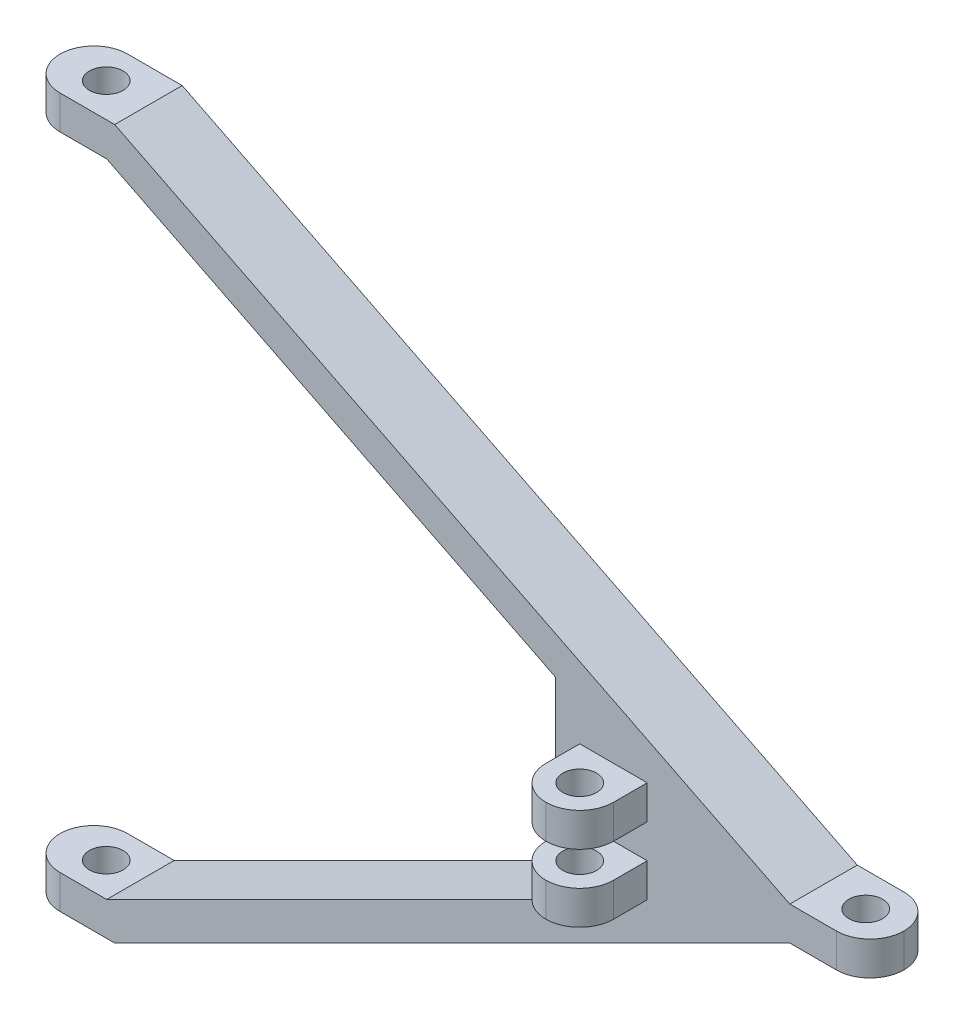
ISO-10303-21;
HEADER;
FILE_DESCRIPTION(('STEP AP214'),'2;1');
FILE_NAME('part.step','',(''),(''),'','','');
FILE_SCHEMA(('AUTOMOTIVE_DESIGN { 1 0 10303 214 1 1 1 1 }'));
ENDSEC;
DATA;
#1=APPLICATION_CONTEXT('core data for automotive mechanical design processes');
#2=APPLICATION_PROTOCOL_DEFINITION('international standard','automotive_design',2000,#1);
#3=PRODUCT_CONTEXT('',#1,'mechanical');
#4=PRODUCT('Part','Part','',(#3));
#5=PRODUCT_RELATED_PRODUCT_CATEGORY('part','',(#4));
#6=PRODUCT_DEFINITION_FORMATION('','',#4);
#7=PRODUCT_DEFINITION_CONTEXT('part definition',#1,'design');
#8=PRODUCT_DEFINITION('design','',#6,#7);
#9=PRODUCT_DEFINITION_SHAPE('','',#8);
#10=(LENGTH_UNIT() NAMED_UNIT(*) SI_UNIT(.MILLI.,.METRE.));
#11=(NAMED_UNIT(*) PLANE_ANGLE_UNIT() SI_UNIT($,.RADIAN.));
#12=(NAMED_UNIT(*) SI_UNIT($,.STERADIAN.) SOLID_ANGLE_UNIT());
#13=UNCERTAINTY_MEASURE_WITH_UNIT(LENGTH_MEASURE(1.E-05),#10,'distance_accuracy_value','');
#14=(GEOMETRIC_REPRESENTATION_CONTEXT(3) GLOBAL_UNCERTAINTY_ASSIGNED_CONTEXT((#13)) GLOBAL_UNIT_ASSIGNED_CONTEXT((#10,
#11,#12)) REPRESENTATION_CONTEXT('',''));
#15=CARTESIAN_POINT('',(0.,0.,0.));
#16=DIRECTION('',(0.,0.,1.));
#17=DIRECTION('',(1.,0.,0.));
#18=AXIS2_PLACEMENT_3D('',#15,#16,#17);
#19=CARTESIAN_POINT('',(0.,0.,20.));
#20=DIRECTION('',(0.,0.,1.));
#21=DIRECTION('',(1.,0.,0.));
#22=AXIS2_PLACEMENT_3D('',#19,#20,#21);
#23=PLANE('',#22);
#24=DIRECTION('',(1.,0.,0.));
#25=VECTOR('',#24,1.);
#26=CARTESIAN_POINT('',(200.,-4.99999999999999,20.));
#27=LINE('',#26,#25);
#28=CARTESIAN_POINT('',(201.180339887499,-4.99999999999996,20.));
#29=VERTEX_POINT('',#28);
#30=CARTESIAN_POINT('',(215.,-5.,20.));
#31=VERTEX_POINT('',#30);
#32=EDGE_CURVE('E448',#29,#31,#27,.T.);
#33=ORIENTED_EDGE('',*,*,#32,.T.);
#34=DIRECTION('',(0.,-1.,0.));
#35=VECTOR('',#34,1.);
#36=CARTESIAN_POINT('',(215.,0.,20.));
#37=LINE('',#36,#35);
#38=CARTESIAN_POINT('',(215.,5.,20.));
#39=VERTEX_POINT('',#38);
#40=EDGE_CURVE('E542',#31,#39,#37,.F.);
#41=ORIENTED_EDGE('',*,*,#40,.T.);
#42=DIRECTION('',(1.,0.,0.));
#43=VECTOR('',#42,1.);
#44=CARTESIAN_POINT('',(200.,5.00000000000001,20.));
#45=LINE('',#44,#43);
#46=CARTESIAN_POINT('',(201.180339887499,5.00000000000001,20.));
#47=VERTEX_POINT('',#46);
#48=EDGE_CURVE('E452',#47,#39,#45,.T.);
#49=ORIENTED_EDGE('',*,*,#48,.F.);
#50=DIRECTION('',(-0.894427190999916,0.447213595499958,0.));
#51=VECTOR('',#50,1.);
#52=CARTESIAN_POINT('',(202.2360679775,4.47213595499959,20.));
#53=LINE('',#52,#51);
#54=CARTESIAN_POINT('',(1.18033988749897,105.,20.));
#55=VERTEX_POINT('',#54);
#56=EDGE_CURVE('E422',#47,#55,#53,.T.);
#57=ORIENTED_EDGE('',*,*,#56,.T.);
#58=DIRECTION('',(1.,0.,0.));
#59=VECTOR('',#58,1.);
#60=CARTESIAN_POINT('',(0.,105.,20.));
#61=LINE('',#60,#59);
#62=CARTESIAN_POINT('',(-15.,105.,20.));
#63=VERTEX_POINT('',#62);
#64=EDGE_CURVE('E410',#55,#63,#61,.F.);
#65=ORIENTED_EDGE('',*,*,#64,.T.);
#66=DIRECTION('',(0.,1.,0.));
#67=VECTOR('',#66,1.);
#68=CARTESIAN_POINT('',(-15.,0.,20.));
#69=LINE('',#68,#67);
#70=CARTESIAN_POINT('',(-15.,95.,20.));
#71=VERTEX_POINT('',#70);
#72=EDGE_CURVE('E539',#63,#71,#69,.F.);
#73=ORIENTED_EDGE('',*,*,#72,.T.);
#74=DIRECTION('',(1.,0.,0.));
#75=VECTOR('',#74,1.);
#76=CARTESIAN_POINT('',(0.,95.,20.));
#77=LINE('',#76,#75);
#78=CARTESIAN_POINT('',(-1.18033988749891,95.,20.));
#79=VERTEX_POINT('',#78);
#80=EDGE_CURVE('E414',#79,#71,#77,.F.);
#81=ORIENTED_EDGE('',*,*,#80,.F.);
#82=DIRECTION('',(-0.894427190999916,0.447213595499958,0.));
#83=VECTOR('',#82,1.);
#84=CARTESIAN_POINT('',(197.7639320225,-4.47213595499957,20.));
#85=LINE('',#84,#83);
#86=CARTESIAN_POINT('',(131.729669907312,28.5449951025946,20.));
#87=VERTEX_POINT('',#86);
#88=EDGE_CURVE('E419',#87,#79,#85,.T.);
#89=ORIENTED_EDGE('',*,*,#88,.F.);
#90=DIRECTION('',(0.,-1.,0.));
#91=VECTOR('',#90,1.);
#92=CARTESIAN_POINT('',(131.729669907312,-39.7253349900934,20.));
#93=LINE('',#92,#91);
#94=CARTESIAN_POINT('',(131.729669907312,-28.5449951025946,20.));
#95=VERTEX_POINT('',#94);
#96=EDGE_CURVE('E375',#87,#95,#93,.T.);
#97=ORIENTED_EDGE('',*,*,#96,.T.);
#98=DIRECTION('',(-0.894427190999916,-0.447213595499958,0.));
#99=VECTOR('',#98,1.);
#100=CARTESIAN_POINT('',(197.7639320225,4.47213595499959,20.));
#101=LINE('',#100,#99);
#102=CARTESIAN_POINT('',(-1.18033988749892,-95.,20.));
#103=VERTEX_POINT('',#102);
#104=EDGE_CURVE('E477',#95,#103,#101,.T.);
#105=ORIENTED_EDGE('',*,*,#104,.T.);
#106=DIRECTION('',(1.,0.,0.));
#107=VECTOR('',#106,1.);
#108=CARTESIAN_POINT('',(0.,-95.,20.));
#109=LINE('',#108,#107);
#110=CARTESIAN_POINT('',(-15.,-95.,20.));
#111=VERTEX_POINT('',#110);
#112=EDGE_CURVE('E465',#103,#111,#109,.F.);
#113=ORIENTED_EDGE('',*,*,#112,.T.);
#114=DIRECTION('',(0.,1.,0.));
#115=VECTOR('',#114,1.);
#116=CARTESIAN_POINT('',(-15.,0.,20.));
#117=LINE('',#116,#115);
#118=CARTESIAN_POINT('',(-15.,-105.,20.));
#119=VERTEX_POINT('',#118);
#120=EDGE_CURVE('E536',#111,#119,#117,.F.);
#121=ORIENTED_EDGE('',*,*,#120,.T.);
#122=DIRECTION('',(1.,0.,0.));
#123=VECTOR('',#122,1.);
#124=CARTESIAN_POINT('',(0.,-105.,20.));
#125=LINE('',#124,#123);
#126=CARTESIAN_POINT('',(1.18033988749898,-105.,20.));
#127=VERTEX_POINT('',#126);
#128=EDGE_CURVE('E469',#127,#119,#125,.F.);
#129=ORIENTED_EDGE('',*,*,#128,.F.);
#130=DIRECTION('',(-0.894427190999916,-0.447213595499958,0.));
#131=VECTOR('',#130,1.);
#132=CARTESIAN_POINT('',(202.2360679775,-4.47213595499957,20.));
#133=LINE('',#132,#131);
#134=EDGE_CURVE('E474',#29,#127,#133,.T.);
#135=ORIENTED_EDGE('',*,*,#134,.F.);
#136=EDGE_LOOP('',(#33,#41,#49,#57,#65,#73,#81,#89,#97,#105,#113,#121,#129,#135));
#137=FACE_BOUND('',#136,.T.);
#138=DIRECTION('',(1.,0.,0.));
#139=VECTOR('',#138,1.);
#140=CARTESIAN_POINT('',(138.953623881755,5.,20.));
#141=LINE('',#140,#139);
#142=CARTESIAN_POINT('',(138.953623881755,5.,20.));
#143=VERTEX_POINT('',#142);
#144=CARTESIAN_POINT('',(158.953623881754,5.,20.));
#145=VERTEX_POINT('',#144);
#146=EDGE_CURVE('E347',#143,#145,#141,.T.);
#147=ORIENTED_EDGE('',*,*,#146,.F.);
#148=DIRECTION('',(0.,-1.,0.));
#149=VECTOR('',#148,1.);
#150=CARTESIAN_POINT('',(138.953623881755,15.,20.));
#151=LINE('',#150,#149);
#152=CARTESIAN_POINT('',(138.953623881755,15.,20.));
#153=VERTEX_POINT('',#152);
#154=EDGE_CURVE('E342',#153,#143,#151,.T.);
#155=ORIENTED_EDGE('',*,*,#154,.F.);
#156=DIRECTION('',(-1.,0.,0.));
#157=VECTOR('',#156,1.);
#158=CARTESIAN_POINT('',(138.953623881755,15.,20.));
#159=LINE('',#158,#157);
#160=CARTESIAN_POINT('',(158.953623881754,15.,20.));
#161=VERTEX_POINT('',#160);
#162=EDGE_CURVE('E359',#161,#153,#159,.T.);
#163=ORIENTED_EDGE('',*,*,#162,.F.);
#164=DIRECTION('',(0.,1.,0.));
#165=VECTOR('',#164,1.);
#166=CARTESIAN_POINT('',(158.953623881754,15.,20.));
#167=LINE('',#166,#165);
#168=EDGE_CURVE('E355',#145,#161,#167,.T.);
#169=ORIENTED_EDGE('',*,*,#168,.F.);
#170=EDGE_LOOP('',(#147,#155,#163,#169));
#171=FACE_BOUND('',#170,.T.);
#172=DIRECTION('',(1.,0.,0.));
#173=VECTOR('',#172,1.);
#174=CARTESIAN_POINT('',(138.953623881755,-15.,20.));
#175=LINE('',#174,#173);
#176=CARTESIAN_POINT('',(138.953623881755,-15.,20.));
#177=VERTEX_POINT('',#176);
#178=CARTESIAN_POINT('',(158.953623881754,-15.,20.));
#179=VERTEX_POINT('',#178);
#180=EDGE_CURVE('E340',#177,#179,#175,.T.);
#181=ORIENTED_EDGE('',*,*,#180,.F.);
#182=DIRECTION('',(0.,-1.,0.));
#183=VECTOR('',#182,1.);
#184=CARTESIAN_POINT('',(138.953623881755,-15.,20.));
#185=LINE('',#184,#183);
#186=CARTESIAN_POINT('',(138.953623881755,-5.,20.));
#187=VERTEX_POINT('',#186);
#188=EDGE_CURVE('E321',#187,#177,#185,.T.);
#189=ORIENTED_EDGE('',*,*,#188,.F.);
#190=DIRECTION('',(-1.,0.,0.));
#191=VECTOR('',#190,1.);
#192=CARTESIAN_POINT('',(138.953623881755,-5.,20.));
#193=LINE('',#192,#191);
#194=CARTESIAN_POINT('',(158.953623881754,-5.,20.));
#195=VERTEX_POINT('',#194);
#196=EDGE_CURVE('E327',#195,#187,#193,.T.);
#197=ORIENTED_EDGE('',*,*,#196,.F.);
#198=DIRECTION('',(0.,1.,0.));
#199=VECTOR('',#198,1.);
#200=CARTESIAN_POINT('',(158.953623881754,-15.,20.));
#201=LINE('',#200,#199);
#202=EDGE_CURVE('E337',#179,#195,#201,.T.);
#203=ORIENTED_EDGE('',*,*,#202,.F.);
#204=EDGE_LOOP('',(#181,#189,#197,#203));
#205=FACE_BOUND('',#204,.T.);
#206=ADVANCED_FACE('F139',(#137,#171,#205),#23,.T.);
#207=CARTESIAN_POINT('',(0.,0.,0.));
#208=DIRECTION('',(0.,0.,1.));
#209=DIRECTION('',(1.,0.,0.));
#210=AXIS2_PLACEMENT_3D('',#207,#208,#209);
#211=PLANE('',#210);
#212=DIRECTION('',(1.,0.,0.));
#213=VECTOR('',#212,1.);
#214=CARTESIAN_POINT('',(200.,5.00000000000001,0.));
#215=LINE('',#214,#213);
#216=CARTESIAN_POINT('',(201.180339887499,5.00000000000001,0.));
#217=VERTEX_POINT('',#216);
#218=CARTESIAN_POINT('',(215.,5.,0.));
#219=VERTEX_POINT('',#218);
#220=EDGE_CURVE('E453',#217,#219,#215,.T.);
#221=ORIENTED_EDGE('',*,*,#220,.T.);
#222=DIRECTION('',(0.,-1.,0.));
#223=VECTOR('',#222,1.);
#224=CARTESIAN_POINT('',(215.,-5.,0.));
#225=LINE('',#224,#223);
#226=CARTESIAN_POINT('',(215.,-5.,0.));
#227=VERTEX_POINT('',#226);
#228=EDGE_CURVE('E520',#219,#227,#225,.T.);
#229=ORIENTED_EDGE('',*,*,#228,.T.);
#230=DIRECTION('',(1.,0.,0.));
#231=VECTOR('',#230,1.);
#232=CARTESIAN_POINT('',(200.,-4.99999999999999,0.));
#233=LINE('',#232,#231);
#234=CARTESIAN_POINT('',(201.180339887499,-4.99999999999996,0.));
#235=VERTEX_POINT('',#234);
#236=EDGE_CURVE('E457',#235,#227,#233,.T.);
#237=ORIENTED_EDGE('',*,*,#236,.F.);
#238=DIRECTION('',(-0.894427190999916,-0.447213595499958,0.));
#239=VECTOR('',#238,1.);
#240=CARTESIAN_POINT('',(202.2360679775,-4.47213595499957,0.));
#241=LINE('',#240,#239);
#242=CARTESIAN_POINT('',(1.18033988749898,-105.,0.));
#243=VERTEX_POINT('',#242);
#244=EDGE_CURVE('E488',#235,#243,#241,.T.);
#245=ORIENTED_EDGE('',*,*,#244,.T.);
#246=DIRECTION('',(1.,0.,0.));
#247=VECTOR('',#246,1.);
#248=CARTESIAN_POINT('',(0.,-105.,0.));
#249=LINE('',#248,#247);
#250=CARTESIAN_POINT('',(-15.,-105.,0.));
#251=VERTEX_POINT('',#250);
#252=EDGE_CURVE('E484',#243,#251,#249,.F.);
#253=ORIENTED_EDGE('',*,*,#252,.T.);
#254=DIRECTION('',(0.,1.,0.));
#255=VECTOR('',#254,1.);
#256=CARTESIAN_POINT('',(-15.,-95.,0.));
#257=LINE('',#256,#255);
#258=CARTESIAN_POINT('',(-15.,-95.,0.));
#259=VERTEX_POINT('',#258);
#260=EDGE_CURVE('E503',#251,#259,#257,.T.);
#261=ORIENTED_EDGE('',*,*,#260,.T.);
#262=DIRECTION('',(1.,0.,0.));
#263=VECTOR('',#262,1.);
#264=CARTESIAN_POINT('',(0.,-95.,0.));
#265=LINE('',#264,#263);
#266=CARTESIAN_POINT('',(-1.18033988749892,-95.,0.));
#267=VERTEX_POINT('',#266);
#268=EDGE_CURVE('E409',#267,#259,#265,.F.);
#269=ORIENTED_EDGE('',*,*,#268,.F.);
#270=DIRECTION('',(-0.894427190999916,-0.447213595499958,0.));
#271=VECTOR('',#270,1.);
#272=CARTESIAN_POINT('',(197.7639320225,4.47213595499959,0.));
#273=LINE('',#272,#271);
#274=CARTESIAN_POINT('',(131.729669907312,-28.5449951025945,0.));
#275=VERTEX_POINT('',#274);
#276=EDGE_CURVE('E470',#275,#267,#273,.T.);
#277=ORIENTED_EDGE('',*,*,#276,.F.);
#278=DIRECTION('',(0.,-1.,0.));
#279=VECTOR('',#278,1.);
#280=CARTESIAN_POINT('',(131.729669907312,-39.7253349900934,0.));
#281=LINE('',#280,#279);
#282=CARTESIAN_POINT('',(131.729669907312,28.5449951025946,0.));
#283=VERTEX_POINT('',#282);
#284=EDGE_CURVE('E376',#283,#275,#281,.T.);
#285=ORIENTED_EDGE('',*,*,#284,.F.);
#286=DIRECTION('',(-0.894427190999916,0.447213595499958,0.));
#287=VECTOR('',#286,1.);
#288=CARTESIAN_POINT('',(197.7639320225,-4.47213595499957,0.));
#289=LINE('',#288,#287);
#290=CARTESIAN_POINT('',(-1.18033988749891,95.,0.));
#291=VERTEX_POINT('',#290);
#292=EDGE_CURVE('E435',#283,#291,#289,.T.);
#293=ORIENTED_EDGE('',*,*,#292,.T.);
#294=DIRECTION('',(1.,0.,0.));
#295=VECTOR('',#294,1.);
#296=CARTESIAN_POINT('',(0.,95.,0.));
#297=LINE('',#296,#295);
#298=CARTESIAN_POINT('',(-15.,95.,0.));
#299=VERTEX_POINT('',#298);
#300=EDGE_CURVE('E430',#291,#299,#297,.F.);
#301=ORIENTED_EDGE('',*,*,#300,.T.);
#302=DIRECTION('',(0.,1.,0.));
#303=VECTOR('',#302,1.);
#304=CARTESIAN_POINT('',(-15.,105.,0.));
#305=LINE('',#304,#303);
#306=CARTESIAN_POINT('',(-15.,105.,0.));
#307=VERTEX_POINT('',#306);
#308=EDGE_CURVE('E516',#299,#307,#305,.T.);
#309=ORIENTED_EDGE('',*,*,#308,.T.);
#310=DIRECTION('',(1.,0.,0.));
#311=VECTOR('',#310,1.);
#312=CARTESIAN_POINT('',(0.,105.,0.));
#313=LINE('',#312,#311);
#314=CARTESIAN_POINT('',(1.18033988749897,105.,0.));
#315=VERTEX_POINT('',#314);
#316=EDGE_CURVE('E426',#315,#307,#313,.F.);
#317=ORIENTED_EDGE('',*,*,#316,.F.);
#318=DIRECTION('',(-0.894427190999916,0.447213595499958,0.));
#319=VECTOR('',#318,1.);
#320=CARTESIAN_POINT('',(202.2360679775,4.47213595499959,0.));
#321=LINE('',#320,#319);
#322=EDGE_CURVE('E415',#217,#315,#321,.T.);
#323=ORIENTED_EDGE('',*,*,#322,.F.);
#324=EDGE_LOOP('',(#221,#229,#237,#245,#253,#261,#269,#277,#285,#293,#301,#309,#317,#323));
#325=FACE_BOUND('',#324,.T.);
#326=ADVANCED_FACE('F664',(#325),#211,.F.);
#327=CARTESIAN_POINT('',(202.2360679775,4.47213595499959,20.));
#328=DIRECTION('',(-0.447213595499958,-0.894427190999916,0.));
#329=DIRECTION('',(0.894427190999916,-0.447213595499958,0.));
#330=AXIS2_PLACEMENT_3D('',#327,#328,#329);
#331=PLANE('',#330);
#332=ORIENTED_EDGE('',*,*,#322,.T.);
#333=DIRECTION('',(0.,0.,-1.));
#334=VECTOR('',#333,1.);
#335=CARTESIAN_POINT('',(1.18033988749897,105.,20.));
#336=LINE('',#335,#334);
#337=EDGE_CURVE('E425',#55,#315,#336,.T.);
#338=ORIENTED_EDGE('',*,*,#337,.F.);
#339=ORIENTED_EDGE('',*,*,#56,.F.);
#340=DIRECTION('',(0.,0.,-1.));
#341=VECTOR('',#340,1.);
#342=CARTESIAN_POINT('',(201.180339887499,5.00000000000001,20.));
#343=LINE('',#342,#341);
#344=EDGE_CURVE('E447',#47,#217,#343,.T.);
#345=ORIENTED_EDGE('',*,*,#344,.T.);
#346=EDGE_LOOP('',(#332,#338,#339,#345));
#347=FACE_BOUND('',#346,.T.);
#348=ADVANCED_FACE('F667',(#347),#331,.F.);
#349=CARTESIAN_POINT('',(0.,105.,20.));
#350=DIRECTION('',(0.,-1.,0.));
#351=DIRECTION('',(0.,0.,-1.));
#352=AXIS2_PLACEMENT_3D('',#349,#350,#351);
#353=PLANE('',#352);
#354=CARTESIAN_POINT('',(-11.319660112501,105.,10.));
#355=DIRECTION('',(0.,-1.,0.));
#356=DIRECTION('',(0.,0.,-1.));
#357=AXIS2_PLACEMENT_3D('',#354,#355,#356);
#358=CIRCLE('',#357,5.);
#359=CARTESIAN_POINT('',(-11.319660112501,105.,5.));
#360=VERTEX_POINT('',#359);
#361=EDGE_CURVE('E405',#360,#360,#358,.T.);
#362=ORIENTED_EDGE('',*,*,#361,.T.);
#363=EDGE_LOOP('',(#362));
#364=FACE_BOUND('',#363,.T.);
#365=ORIENTED_EDGE('',*,*,#316,.T.);
#366=CARTESIAN_POINT('',(-15.,105.,10.));
#367=DIRECTION('',(0.,-1.,0.));
#368=DIRECTION('',(0.,0.,-1.));
#369=AXIS2_PLACEMENT_3D('',#366,#367,#368);
#370=CIRCLE('',#369,10.);
#371=CARTESIAN_POINT('',(-25.,105.,10.));
#372=VERTEX_POINT('',#371);
#373=EDGE_CURVE('E548',#307,#372,#370,.F.);
#374=ORIENTED_EDGE('',*,*,#373,.T.);
#375=CARTESIAN_POINT('',(-15.,105.,10.));
#376=DIRECTION('',(0.,-1.,0.));
#377=DIRECTION('',(0.,0.,-1.));
#378=AXIS2_PLACEMENT_3D('',#375,#376,#377);
#379=CIRCLE('',#378,10.);
#380=EDGE_CURVE('E545',#372,#63,#379,.F.);
#381=ORIENTED_EDGE('',*,*,#380,.T.);
#382=ORIENTED_EDGE('',*,*,#64,.F.);
#383=ORIENTED_EDGE('',*,*,#337,.T.);
#384=EDGE_LOOP('',(#365,#374,#381,#382,#383));
#385=FACE_BOUND('',#384,.T.);
#386=ADVANCED_FACE('F679',(#364,#385),#353,.F.);
#387=CARTESIAN_POINT('',(0.,95.,20.));
#388=DIRECTION('',(0.,-1.,0.));
#389=DIRECTION('',(0.,0.,-1.));
#390=AXIS2_PLACEMENT_3D('',#387,#388,#389);
#391=PLANE('',#390);
#392=CARTESIAN_POINT('',(-11.319660112501,95.,10.));
#393=DIRECTION('',(0.,-1.,0.));
#394=DIRECTION('',(0.,0.,-1.));
#395=AXIS2_PLACEMENT_3D('',#392,#393,#394);
#396=CIRCLE('',#395,5.);
#397=CARTESIAN_POINT('',(-11.319660112501,95.,5.));
#398=VERTEX_POINT('',#397);
#399=EDGE_CURVE('E401',#398,#398,#396,.T.);
#400=ORIENTED_EDGE('',*,*,#399,.F.);
#401=EDGE_LOOP('',(#400));
#402=FACE_BOUND('',#401,.T.);
#403=CARTESIAN_POINT('',(-15.,95.,10.));
#404=DIRECTION('',(0.,-1.,0.));
#405=DIRECTION('',(0.,0.,-1.));
#406=AXIS2_PLACEMENT_3D('',#403,#404,#405);
#407=CIRCLE('',#406,10.);
#408=CARTESIAN_POINT('',(-25.,95.,10.));
#409=VERTEX_POINT('',#408);
#410=EDGE_CURVE('E551',#71,#409,#407,.T.);
#411=ORIENTED_EDGE('',*,*,#410,.T.);
#412=CARTESIAN_POINT('',(-15.,95.,10.));
#413=DIRECTION('',(0.,-1.,0.));
#414=DIRECTION('',(0.,0.,-1.));
#415=AXIS2_PLACEMENT_3D('',#412,#413,#414);
#416=CIRCLE('',#415,10.);
#417=EDGE_CURVE('E554',#409,#299,#416,.T.);
#418=ORIENTED_EDGE('',*,*,#417,.T.);
#419=ORIENTED_EDGE('',*,*,#300,.F.);
#420=DIRECTION('',(0.,0.,-1.));
#421=VECTOR('',#420,1.);
#422=CARTESIAN_POINT('',(-1.18033988749891,95.,20.));
#423=LINE('',#422,#421);
#424=EDGE_CURVE('E443',#79,#291,#423,.T.);
#425=ORIENTED_EDGE('',*,*,#424,.F.);
#426=ORIENTED_EDGE('',*,*,#80,.T.);
#427=EDGE_LOOP('',(#411,#418,#419,#425,#426));
#428=FACE_BOUND('',#427,.T.);
#429=ADVANCED_FACE('F687',(#402,#428),#391,.T.);
#430=CARTESIAN_POINT('',(197.7639320225,-4.47213595499957,20.));
#431=DIRECTION('',(-0.447213595499958,-0.894427190999916,0.));
#432=DIRECTION('',(0.894427190999916,-0.447213595499958,0.));
#433=AXIS2_PLACEMENT_3D('',#430,#431,#432);
#434=PLANE('',#433);
#435=DIRECTION('',(0.,0.,-1.));
#436=VECTOR('',#435,1.);
#437=CARTESIAN_POINT('',(131.729669907312,28.5449951025946,20.));
#438=LINE('',#437,#436);
#439=EDGE_CURVE('E385',#87,#283,#438,.T.);
#440=ORIENTED_EDGE('',*,*,#439,.F.);
#441=ORIENTED_EDGE('',*,*,#88,.T.);
#442=ORIENTED_EDGE('',*,*,#424,.T.);
#443=ORIENTED_EDGE('',*,*,#292,.F.);
#444=EDGE_LOOP('',(#440,#441,#442,#443));
#445=FACE_BOUND('',#444,.T.);
#446=ADVANCED_FACE('F691',(#445),#434,.T.);
#447=CARTESIAN_POINT('',(197.7639320225,4.47213595499959,20.));
#448=DIRECTION('',(0.447213595499958,-0.894427190999916,0.));
#449=DIRECTION('',(0.894427190999916,0.447213595499958,0.));
#450=AXIS2_PLACEMENT_3D('',#447,#448,#449);
#451=PLANE('',#450);
#452=ORIENTED_EDGE('',*,*,#104,.F.);
#453=DIRECTION('',(0.,0.,-1.));
#454=VECTOR('',#453,1.);
#455=CARTESIAN_POINT('',(131.729669907312,-28.5449951025945,20.));
#456=LINE('',#455,#454);
#457=EDGE_CURVE('E379',#95,#275,#456,.T.);
#458=ORIENTED_EDGE('',*,*,#457,.T.);
#459=ORIENTED_EDGE('',*,*,#276,.T.);
#460=DIRECTION('',(0.,0.,-1.));
#461=VECTOR('',#460,1.);
#462=CARTESIAN_POINT('',(-1.18033988749892,-95.,20.));
#463=LINE('',#462,#461);
#464=EDGE_CURVE('E480',#103,#267,#463,.T.);
#465=ORIENTED_EDGE('',*,*,#464,.F.);
#466=EDGE_LOOP('',(#452,#458,#459,#465));
#467=FACE_BOUND('',#466,.T.);
#468=ADVANCED_FACE('F693',(#467),#451,.F.);
#469=CARTESIAN_POINT('',(0.,-95.,20.));
#470=DIRECTION('',(0.,-1.,0.));
#471=DIRECTION('',(0.,0.,-1.));
#472=AXIS2_PLACEMENT_3D('',#469,#470,#471);
#473=PLANE('',#472);
#474=CARTESIAN_POINT('',(-11.319660112501,-95.,10.));
#475=DIRECTION('',(0.,-1.,0.));
#476=DIRECTION('',(0.,0.,-1.));
#477=AXIS2_PLACEMENT_3D('',#474,#475,#476);
#478=CIRCLE('',#477,5.);
#479=CARTESIAN_POINT('',(-11.319660112501,-95.,5.));
#480=VERTEX_POINT('',#479);
#481=EDGE_CURVE('E397',#480,#480,#478,.T.);
#482=ORIENTED_EDGE('',*,*,#481,.T.);
#483=EDGE_LOOP('',(#482));
#484=FACE_BOUND('',#483,.T.);
#485=ORIENTED_EDGE('',*,*,#268,.T.);
#486=CARTESIAN_POINT('',(-15.,-95.,10.));
#487=DIRECTION('',(0.,-1.,0.));
#488=DIRECTION('',(0.,0.,-1.));
#489=AXIS2_PLACEMENT_3D('',#486,#487,#488);
#490=CIRCLE('',#489,10.);
#491=CARTESIAN_POINT('',(-25.,-95.,10.));
#492=VERTEX_POINT('',#491);
#493=EDGE_CURVE('E560',#259,#492,#490,.F.);
#494=ORIENTED_EDGE('',*,*,#493,.T.);
#495=CARTESIAN_POINT('',(-15.,-95.,10.));
#496=DIRECTION('',(0.,-1.,0.));
#497=DIRECTION('',(0.,0.,-1.));
#498=AXIS2_PLACEMENT_3D('',#495,#496,#497);
#499=CIRCLE('',#498,10.);
#500=EDGE_CURVE('E557',#492,#111,#499,.F.);
#501=ORIENTED_EDGE('',*,*,#500,.T.);
#502=ORIENTED_EDGE('',*,*,#112,.F.);
#503=ORIENTED_EDGE('',*,*,#464,.T.);
#504=EDGE_LOOP('',(#485,#494,#501,#502,#503));
#505=FACE_BOUND('',#504,.T.);
#506=ADVANCED_FACE('F708',(#484,#505),#473,.F.);
#507=CARTESIAN_POINT('',(0.,-105.,20.));
#508=DIRECTION('',(0.,-1.,0.));
#509=DIRECTION('',(0.,0.,-1.));
#510=AXIS2_PLACEMENT_3D('',#507,#508,#509);
#511=PLANE('',#510);
#512=CARTESIAN_POINT('',(-11.319660112501,-105.,10.));
#513=DIRECTION('',(0.,-1.,0.));
#514=DIRECTION('',(0.,0.,-1.));
#515=AXIS2_PLACEMENT_3D('',#512,#513,#514);
#516=CIRCLE('',#515,5.);
#517=CARTESIAN_POINT('',(-11.319660112501,-105.,5.));
#518=VERTEX_POINT('',#517);
#519=EDGE_CURVE('E388',#518,#518,#516,.T.);
#520=ORIENTED_EDGE('',*,*,#519,.F.);
#521=EDGE_LOOP('',(#520));
#522=FACE_BOUND('',#521,.T.);
#523=CARTESIAN_POINT('',(-15.,-105.,10.));
#524=DIRECTION('',(0.,-1.,0.));
#525=DIRECTION('',(0.,0.,-1.));
#526=AXIS2_PLACEMENT_3D('',#523,#524,#525);
#527=CIRCLE('',#526,10.);
#528=CARTESIAN_POINT('',(-25.,-105.,10.));
#529=VERTEX_POINT('',#528);
#530=EDGE_CURVE('E563',#119,#529,#527,.T.);
#531=ORIENTED_EDGE('',*,*,#530,.T.);
#532=CARTESIAN_POINT('',(-15.,-105.,10.));
#533=DIRECTION('',(0.,-1.,0.));
#534=DIRECTION('',(0.,0.,-1.));
#535=AXIS2_PLACEMENT_3D('',#532,#533,#534);
#536=CIRCLE('',#535,10.);
#537=EDGE_CURVE('E566',#529,#251,#536,.T.);
#538=ORIENTED_EDGE('',*,*,#537,.T.);
#539=ORIENTED_EDGE('',*,*,#252,.F.);
#540=DIRECTION('',(0.,0.,-1.));
#541=VECTOR('',#540,1.);
#542=CARTESIAN_POINT('',(1.18033988749898,-105.,20.));
#543=LINE('',#542,#541);
#544=EDGE_CURVE('E461',#127,#243,#543,.T.);
#545=ORIENTED_EDGE('',*,*,#544,.F.);
#546=ORIENTED_EDGE('',*,*,#128,.T.);
#547=EDGE_LOOP('',(#531,#538,#539,#545,#546));
#548=FACE_BOUND('',#547,.T.);
#549=ADVANCED_FACE('F712',(#522,#548),#511,.T.);
#550=CARTESIAN_POINT('',(202.2360679775,-4.47213595499957,20.));
#551=DIRECTION('',(0.447213595499958,-0.894427190999916,0.));
#552=DIRECTION('',(0.894427190999916,0.447213595499958,0.));
#553=AXIS2_PLACEMENT_3D('',#550,#551,#552);
#554=PLANE('',#553);
#555=ORIENTED_EDGE('',*,*,#134,.T.);
#556=ORIENTED_EDGE('',*,*,#544,.T.);
#557=ORIENTED_EDGE('',*,*,#244,.F.);
#558=DIRECTION('',(0.,0.,-1.));
#559=VECTOR('',#558,1.);
#560=CARTESIAN_POINT('',(201.180339887499,-4.99999999999999,20.));
#561=LINE('',#560,#559);
#562=EDGE_CURVE('E431',#29,#235,#561,.T.);
#563=ORIENTED_EDGE('',*,*,#562,.F.);
#564=EDGE_LOOP('',(#555,#556,#557,#563));
#565=FACE_BOUND('',#564,.T.);
#566=ADVANCED_FACE('F704',(#565),#554,.T.);
#567=CARTESIAN_POINT('',(200.,-4.99999999999999,20.));
#568=DIRECTION('',(0.,1.,0.));
#569=DIRECTION('',(-1.,0.,0.));
#570=AXIS2_PLACEMENT_3D('',#567,#568,#569);
#571=PLANE('',#570);
#572=CARTESIAN_POINT('',(213.680339887499,-5.,10.));
#573=DIRECTION('',(0.,1.,0.));
#574=DIRECTION('',(-1.,0.,0.));
#575=AXIS2_PLACEMENT_3D('',#572,#573,#574);
#576=CIRCLE('',#575,4.99999999999999);
#577=CARTESIAN_POINT('',(208.680339887499,-5.,10.));
#578=VERTEX_POINT('',#577);
#579=EDGE_CURVE('E393',#578,#578,#576,.T.);
#580=ORIENTED_EDGE('',*,*,#579,.T.);
#581=EDGE_LOOP('',(#580));
#582=FACE_BOUND('',#581,.T.);
#583=ORIENTED_EDGE('',*,*,#236,.T.);
#584=CARTESIAN_POINT('',(215.,-5.,10.));
#585=DIRECTION('',(0.,1.,0.));
#586=DIRECTION('',(-1.,0.,0.));
#587=AXIS2_PLACEMENT_3D('',#584,#585,#586);
#588=CIRCLE('',#587,10.);
#589=CARTESIAN_POINT('',(225.,-5.,10.));
#590=VERTEX_POINT('',#589);
#591=EDGE_CURVE('E527',#227,#590,#588,.F.);
#592=ORIENTED_EDGE('',*,*,#591,.T.);
#593=CARTESIAN_POINT('',(215.,-5.,10.));
#594=DIRECTION('',(0.,1.,0.));
#595=DIRECTION('',(-1.,0.,0.));
#596=AXIS2_PLACEMENT_3D('',#593,#594,#595);
#597=CIRCLE('',#596,10.);
#598=EDGE_CURVE('E524',#590,#31,#597,.F.);
#599=ORIENTED_EDGE('',*,*,#598,.T.);
#600=ORIENTED_EDGE('',*,*,#32,.F.);
#601=ORIENTED_EDGE('',*,*,#562,.T.);
#602=EDGE_LOOP('',(#583,#592,#599,#600,#601));
#603=FACE_BOUND('',#602,.T.);
#604=ADVANCED_FACE('F700',(#582,#603),#571,.F.);
#605=CARTESIAN_POINT('',(200.,5.00000000000001,20.));
#606=DIRECTION('',(0.,1.,0.));
#607=DIRECTION('',(-1.,0.,0.));
#608=AXIS2_PLACEMENT_3D('',#605,#606,#607);
#609=PLANE('',#608);
#610=CARTESIAN_POINT('',(213.680339887499,5.,10.));
#611=DIRECTION('',(0.,1.,0.));
#612=DIRECTION('',(-1.,0.,0.));
#613=AXIS2_PLACEMENT_3D('',#610,#611,#612);
#614=CIRCLE('',#613,4.99999999999999);
#615=CARTESIAN_POINT('',(208.680339887499,5.00000000000001,10.));
#616=VERTEX_POINT('',#615);
#617=EDGE_CURVE('E392',#616,#616,#614,.T.);
#618=ORIENTED_EDGE('',*,*,#617,.F.);
#619=EDGE_LOOP('',(#618));
#620=FACE_BOUND('',#619,.T.);
#621=CARTESIAN_POINT('',(215.,5.,10.));
#622=DIRECTION('',(0.,1.,0.));
#623=DIRECTION('',(-1.,0.,0.));
#624=AXIS2_PLACEMENT_3D('',#621,#622,#623);
#625=CIRCLE('',#624,10.);
#626=CARTESIAN_POINT('',(225.,5.,10.));
#627=VERTEX_POINT('',#626);
#628=EDGE_CURVE('E530',#39,#627,#625,.T.);
#629=ORIENTED_EDGE('',*,*,#628,.T.);
#630=CARTESIAN_POINT('',(215.,5.,10.));
#631=DIRECTION('',(0.,1.,0.));
#632=DIRECTION('',(-1.,0.,0.));
#633=AXIS2_PLACEMENT_3D('',#630,#631,#632);
#634=CIRCLE('',#633,10.);
#635=EDGE_CURVE('E533',#627,#219,#634,.T.);
#636=ORIENTED_EDGE('',*,*,#635,.T.);
#637=ORIENTED_EDGE('',*,*,#220,.F.);
#638=ORIENTED_EDGE('',*,*,#344,.F.);
#639=ORIENTED_EDGE('',*,*,#48,.T.);
#640=EDGE_LOOP('',(#629,#636,#637,#638,#639));
#641=FACE_BOUND('',#640,.T.);
#642=ADVANCED_FACE('F675',(#620,#641),#609,.T.);
#643=CARTESIAN_POINT('',(213.680339887499,130.,10.));
#644=DIRECTION('',(0.,-1.,0.));
#645=DIRECTION('',(0.,0.,-1.));
#646=AXIS2_PLACEMENT_3D('',#643,#644,#645);
#647=CYLINDRICAL_SURFACE('',#646,4.99999999999999);
#648=ORIENTED_EDGE('',*,*,#617,.T.);
#649=EDGE_LOOP('',(#648));
#650=FACE_BOUND('',#649,.T.);
#651=ORIENTED_EDGE('',*,*,#579,.F.);
#652=EDGE_LOOP('',(#651));
#653=FACE_BOUND('',#652,.T.);
#654=ADVANCED_FACE('F674',(#650,#653),#647,.F.);
#655=CARTESIAN_POINT('',(-11.319660112501,130.,10.));
#656=DIRECTION('',(0.,-1.,0.));
#657=DIRECTION('',(0.,0.,-1.));
#658=AXIS2_PLACEMENT_3D('',#655,#656,#657);
#659=CYLINDRICAL_SURFACE('',#658,5.);
#660=ORIENTED_EDGE('',*,*,#519,.T.);
#661=EDGE_LOOP('',(#660));
#662=FACE_BOUND('',#661,.T.);
#663=ORIENTED_EDGE('',*,*,#481,.F.);
#664=EDGE_LOOP('',(#663));
#665=FACE_BOUND('',#664,.T.);
#666=ADVANCED_FACE('F977',(#662,#665),#659,.F.);
#667=ORIENTED_EDGE('',*,*,#399,.T.);
#668=EDGE_LOOP('',(#667));
#669=FACE_BOUND('',#668,.T.);
#670=ORIENTED_EDGE('',*,*,#361,.F.);
#671=EDGE_LOOP('',(#670));
#672=FACE_BOUND('',#671,.T.);
#673=ADVANCED_FACE('F924',(#669,#672),#659,.F.);
#674=CARTESIAN_POINT('',(131.729669907312,-39.7253349900934,0.));
#675=DIRECTION('',(-1.,0.,0.));
#676=DIRECTION('',(0.,-1.,0.));
#677=AXIS2_PLACEMENT_3D('',#674,#675,#676);
#678=PLANE('',#677);
#679=ORIENTED_EDGE('',*,*,#96,.F.);
#680=ORIENTED_EDGE('',*,*,#439,.T.);
#681=ORIENTED_EDGE('',*,*,#284,.T.);
#682=ORIENTED_EDGE('',*,*,#457,.F.);
#683=EDGE_LOOP('',(#679,#680,#681,#682));
#684=FACE_BOUND('',#683,.T.);
#685=ADVANCED_FACE('F867',(#684),#678,.T.);
#686=CARTESIAN_POINT('',(138.953623881755,15.,40.));
#687=DIRECTION('',(1.,0.,0.));
#688=DIRECTION('',(0.,0.,-1.));
#689=AXIS2_PLACEMENT_3D('',#686,#687,#688);
#690=PLANE('',#689);
#691=DIRECTION('',(0.,0.,-1.));
#692=VECTOR('',#691,1.);
#693=CARTESIAN_POINT('',(138.953623881755,5.,40.));
#694=LINE('',#693,#692);
#695=CARTESIAN_POINT('',(138.953623881755,5.,30.));
#696=VERTEX_POINT('',#695);
#697=EDGE_CURVE('E372',#696,#143,#694,.T.);
#698=ORIENTED_EDGE('',*,*,#697,.F.);
#699=DIRECTION('',(0.,-1.,0.));
#700=VECTOR('',#699,1.);
#701=CARTESIAN_POINT('',(138.953623881755,15.,30.));
#702=LINE('',#701,#700);
#703=CARTESIAN_POINT('',(138.953623881755,15.,30.));
#704=VERTEX_POINT('',#703);
#705=EDGE_CURVE('E575',#696,#704,#702,.F.);
#706=ORIENTED_EDGE('',*,*,#705,.T.);
#707=DIRECTION('',(0.,0.,-1.));
#708=VECTOR('',#707,1.);
#709=CARTESIAN_POINT('',(138.953623881755,15.,40.));
#710=LINE('',#709,#708);
#711=EDGE_CURVE('E363',#704,#153,#710,.T.);
#712=ORIENTED_EDGE('',*,*,#711,.T.);
#713=ORIENTED_EDGE('',*,*,#154,.T.);
#714=EDGE_LOOP('',(#698,#706,#712,#713));
#715=FACE_BOUND('',#714,.T.);
#716=ADVANCED_FACE('F857',(#715),#690,.F.);
#717=CARTESIAN_POINT('',(138.953623881755,5.,40.));
#718=DIRECTION('',(0.,1.,0.));
#719=DIRECTION('',(0.,0.,1.));
#720=AXIS2_PLACEMENT_3D('',#717,#718,#719);
#721=PLANE('',#720);
#722=CARTESIAN_POINT('',(148.953623881754,5.,30.));
#723=DIRECTION('',(0.,1.,0.));
#724=DIRECTION('',(0.,0.,1.));
#725=AXIS2_PLACEMENT_3D('',#722,#723,#724);
#726=CIRCLE('',#725,4.99999999999999);
#727=CARTESIAN_POINT('',(148.953623881754,5.,35.));
#728=VERTEX_POINT('',#727);
#729=EDGE_CURVE('E639',#728,#728,#726,.T.);
#730=ORIENTED_EDGE('',*,*,#729,.T.);
#731=EDGE_LOOP('',(#730));
#732=FACE_BOUND('',#731,.T.);
#733=CARTESIAN_POINT('',(148.953623881754,5.,30.));
#734=DIRECTION('',(0.,1.,0.));
#735=DIRECTION('',(0.,0.,1.));
#736=AXIS2_PLACEMENT_3D('',#733,#734,#735);
#737=CIRCLE('',#736,10.);
#738=CARTESIAN_POINT('',(158.953623881754,5.,30.));
#739=VERTEX_POINT('',#738);
#740=CARTESIAN_POINT('',(148.953623881754,5.,40.));
#741=VERTEX_POINT('',#740);
#742=EDGE_CURVE('E569',#739,#741,#737,.F.);
#743=ORIENTED_EDGE('',*,*,#742,.T.);
#744=CARTESIAN_POINT('',(148.953623881755,5.,30.));
#745=DIRECTION('',(0.,1.,0.));
#746=DIRECTION('',(0.,0.,1.));
#747=AXIS2_PLACEMENT_3D('',#744,#745,#746);
#748=CIRCLE('',#747,10.);
#749=EDGE_CURVE('E572',#741,#696,#748,.F.);
#750=ORIENTED_EDGE('',*,*,#749,.T.);
#751=ORIENTED_EDGE('',*,*,#697,.T.);
#752=ORIENTED_EDGE('',*,*,#146,.T.);
#753=DIRECTION('',(0.,0.,-1.));
#754=VECTOR('',#753,1.);
#755=CARTESIAN_POINT('',(158.953623881754,5.,40.));
#756=LINE('',#755,#754);
#757=EDGE_CURVE('E369',#739,#145,#756,.T.);
#758=ORIENTED_EDGE('',*,*,#757,.F.);
#759=EDGE_LOOP('',(#743,#750,#751,#752,#758));
#760=FACE_BOUND('',#759,.T.);
#761=ADVANCED_FACE('F846',(#732,#760),#721,.F.);
#762=CARTESIAN_POINT('',(158.953623881754,15.,40.));
#763=DIRECTION('',(-1.,0.,0.));
#764=DIRECTION('',(0.,0.,1.));
#765=AXIS2_PLACEMENT_3D('',#762,#763,#764);
#766=PLANE('',#765);
#767=DIRECTION('',(0.,0.,-1.));
#768=VECTOR('',#767,1.);
#769=CARTESIAN_POINT('',(158.953623881754,15.,40.));
#770=LINE('',#769,#768);
#771=CARTESIAN_POINT('',(158.953623881754,15.,30.));
#772=VERTEX_POINT('',#771);
#773=EDGE_CURVE('E366',#772,#161,#770,.T.);
#774=ORIENTED_EDGE('',*,*,#773,.F.);
#775=DIRECTION('',(0.,1.,0.));
#776=VECTOR('',#775,1.);
#777=CARTESIAN_POINT('',(158.953623881754,5.,30.));
#778=LINE('',#777,#776);
#779=EDGE_CURVE('E585',#772,#739,#778,.F.);
#780=ORIENTED_EDGE('',*,*,#779,.T.);
#781=ORIENTED_EDGE('',*,*,#757,.T.);
#782=ORIENTED_EDGE('',*,*,#168,.T.);
#783=EDGE_LOOP('',(#774,#780,#781,#782));
#784=FACE_BOUND('',#783,.T.);
#785=ADVANCED_FACE('F835',(#784),#766,.F.);
#786=CARTESIAN_POINT('',(138.953623881755,15.,40.));
#787=DIRECTION('',(0.,-1.,0.));
#788=DIRECTION('',(0.,0.,-1.));
#789=AXIS2_PLACEMENT_3D('',#786,#787,#788);
#790=PLANE('',#789);
#791=CARTESIAN_POINT('',(148.953623881754,15.,30.));
#792=DIRECTION('',(0.,-1.,0.));
#793=DIRECTION('',(0.,0.,-1.));
#794=AXIS2_PLACEMENT_3D('',#791,#792,#793);
#795=CIRCLE('',#794,4.99999999999999);
#796=CARTESIAN_POINT('',(148.953623881754,15.,25.));
#797=VERTEX_POINT('',#796);
#798=EDGE_CURVE('E511',#797,#797,#795,.T.);
#799=ORIENTED_EDGE('',*,*,#798,.T.);
#800=EDGE_LOOP('',(#799));
#801=FACE_BOUND('',#800,.T.);
#802=ORIENTED_EDGE('',*,*,#711,.F.);
#803=CARTESIAN_POINT('',(148.953623881755,15.,30.));
#804=DIRECTION('',(0.,-1.,0.));
#805=DIRECTION('',(0.,0.,-1.));
#806=AXIS2_PLACEMENT_3D('',#803,#804,#805);
#807=CIRCLE('',#806,10.);
#808=CARTESIAN_POINT('',(148.953623881754,15.,40.));
#809=VERTEX_POINT('',#808);
#810=EDGE_CURVE('E582',#704,#809,#807,.F.);
#811=ORIENTED_EDGE('',*,*,#810,.T.);
#812=CARTESIAN_POINT('',(148.953623881754,15.,30.));
#813=DIRECTION('',(0.,-1.,0.));
#814=DIRECTION('',(0.,0.,-1.));
#815=AXIS2_PLACEMENT_3D('',#812,#813,#814);
#816=CIRCLE('',#815,10.);
#817=EDGE_CURVE('E579',#809,#772,#816,.F.);
#818=ORIENTED_EDGE('',*,*,#817,.T.);
#819=ORIENTED_EDGE('',*,*,#773,.T.);
#820=ORIENTED_EDGE('',*,*,#162,.T.);
#821=EDGE_LOOP('',(#802,#811,#818,#819,#820));
#822=FACE_BOUND('',#821,.T.);
#823=ADVANCED_FACE('F661',(#801,#822),#790,.F.);
#824=CARTESIAN_POINT('',(138.953623881755,-15.,40.));
#825=DIRECTION('',(1.,0.,0.));
#826=DIRECTION('',(0.,0.,-1.));
#827=AXIS2_PLACEMENT_3D('',#824,#825,#826);
#828=PLANE('',#827);
#829=DIRECTION('',(0.,0.,-1.));
#830=VECTOR('',#829,1.);
#831=CARTESIAN_POINT('',(138.953623881755,-15.,40.));
#832=LINE('',#831,#830);
#833=CARTESIAN_POINT('',(138.953623881755,-15.,30.));
#834=VERTEX_POINT('',#833);
#835=EDGE_CURVE('E633',#834,#177,#832,.T.);
#836=ORIENTED_EDGE('',*,*,#835,.F.);
#837=DIRECTION('',(0.,-1.,0.));
#838=VECTOR('',#837,1.);
#839=CARTESIAN_POINT('',(138.953623881755,-15.,30.));
#840=LINE('',#839,#838);
#841=CARTESIAN_POINT('',(138.953623881755,-5.,30.));
#842=VERTEX_POINT('',#841);
#843=EDGE_CURVE('E12',#834,#842,#840,.F.);
#844=ORIENTED_EDGE('',*,*,#843,.T.);
#845=DIRECTION('',(0.,0.,-1.));
#846=VECTOR('',#845,1.);
#847=CARTESIAN_POINT('',(138.953623881755,-5.,40.));
#848=LINE('',#847,#846);
#849=EDGE_CURVE('E317',#842,#187,#848,.T.);
#850=ORIENTED_EDGE('',*,*,#849,.T.);
#851=ORIENTED_EDGE('',*,*,#188,.T.);
#852=EDGE_LOOP('',(#836,#844,#850,#851));
#853=FACE_BOUND('',#852,.T.);
#854=ADVANCED_FACE('F319',(#853),#828,.F.);
#855=CARTESIAN_POINT('',(138.953623881755,-15.,40.));
#856=DIRECTION('',(0.,1.,0.));
#857=DIRECTION('',(0.,0.,1.));
#858=AXIS2_PLACEMENT_3D('',#855,#856,#857);
#859=PLANE('',#858);
#860=CARTESIAN_POINT('',(148.953623881754,-15.,30.));
#861=DIRECTION('',(0.,-1.,0.));
#862=DIRECTION('',(0.,0.,-1.));
#863=AXIS2_PLACEMENT_3D('',#860,#861,#862);
#864=CIRCLE('',#863,4.99999999999999);
#865=CARTESIAN_POINT('',(148.953623881754,-15.,25.));
#866=VERTEX_POINT('',#865);
#867=EDGE_CURVE('E512',#866,#866,#864,.T.);
#868=ORIENTED_EDGE('',*,*,#867,.F.);
#869=EDGE_LOOP('',(#868));
#870=FACE_BOUND('',#869,.T.);
#871=DIRECTION('',(0.,0.,-1.));
#872=VECTOR('',#871,1.);
#873=CARTESIAN_POINT('',(158.953623881754,-15.,40.));
#874=LINE('',#873,#872);
#875=CARTESIAN_POINT('',(158.953623881754,-15.,30.));
#876=VERTEX_POINT('',#875);
#877=EDGE_CURVE('E630',#876,#179,#874,.T.);
#878=ORIENTED_EDGE('',*,*,#877,.F.);
#879=CARTESIAN_POINT('',(148.953623881754,-15.,30.));
#880=DIRECTION('',(0.,1.,0.));
#881=DIRECTION('',(0.,0.,1.));
#882=AXIS2_PLACEMENT_3D('',#879,#880,#881);
#883=CIRCLE('',#882,10.);
#884=CARTESIAN_POINT('',(148.953623881755,-15.,40.));
#885=VERTEX_POINT('',#884);
#886=EDGE_CURVE('E149',#876,#885,#883,.F.);
#887=ORIENTED_EDGE('',*,*,#886,.T.);
#888=CARTESIAN_POINT('',(148.953623881755,-15.,30.));
#889=DIRECTION('',(0.,1.,0.));
#890=DIRECTION('',(0.,0.,1.));
#891=AXIS2_PLACEMENT_3D('',#888,#889,#890);
#892=CIRCLE('',#891,10.);
#893=EDGE_CURVE('E157',#885,#834,#892,.F.);
#894=ORIENTED_EDGE('',*,*,#893,.T.);
#895=ORIENTED_EDGE('',*,*,#835,.T.);
#896=ORIENTED_EDGE('',*,*,#180,.T.);
#897=EDGE_LOOP('',(#878,#887,#894,#895,#896));
#898=FACE_BOUND('',#897,.T.);
#899=ADVANCED_FACE('F653',(#870,#898),#859,.F.);
#900=CARTESIAN_POINT('',(158.953623881754,-15.,40.));
#901=DIRECTION('',(-1.,0.,0.));
#902=DIRECTION('',(0.,0.,1.));
#903=AXIS2_PLACEMENT_3D('',#900,#901,#902);
#904=PLANE('',#903);
#905=DIRECTION('',(0.,0.,-1.));
#906=VECTOR('',#905,1.);
#907=CARTESIAN_POINT('',(158.953623881754,-5.,40.));
#908=LINE('',#907,#906);
#909=CARTESIAN_POINT('',(158.953623881754,-5.,30.));
#910=VERTEX_POINT('',#909);
#911=EDGE_CURVE('E328',#910,#195,#908,.T.);
#912=ORIENTED_EDGE('',*,*,#911,.F.);
#913=DIRECTION('',(0.,1.,0.));
#914=VECTOR('',#913,1.);
#915=CARTESIAN_POINT('',(158.953623881754,-15.,30.));
#916=LINE('',#915,#914);
#917=EDGE_CURVE('E594',#910,#876,#916,.F.);
#918=ORIENTED_EDGE('',*,*,#917,.T.);
#919=ORIENTED_EDGE('',*,*,#877,.T.);
#920=ORIENTED_EDGE('',*,*,#202,.T.);
#921=EDGE_LOOP('',(#912,#918,#919,#920));
#922=FACE_BOUND('',#921,.T.);
#923=ADVANCED_FACE('F628',(#922),#904,.F.);
#924=CARTESIAN_POINT('',(138.953623881755,-5.,40.));
#925=DIRECTION('',(0.,-1.,0.));
#926=DIRECTION('',(0.,0.,-1.));
#927=AXIS2_PLACEMENT_3D('',#924,#925,#926);
#928=PLANE('',#927);
#929=CARTESIAN_POINT('',(148.953623881754,-5.,30.));
#930=DIRECTION('',(0.,-1.,0.));
#931=DIRECTION('',(0.,0.,-1.));
#932=AXIS2_PLACEMENT_3D('',#929,#930,#931);
#933=CIRCLE('',#932,4.99999999999999);
#934=CARTESIAN_POINT('',(148.953623881754,-5.,25.));
#935=VERTEX_POINT('',#934);
#936=EDGE_CURVE('E507',#935,#935,#933,.T.);
#937=ORIENTED_EDGE('',*,*,#936,.T.);
#938=EDGE_LOOP('',(#937));
#939=FACE_BOUND('',#938,.T.);
#940=CARTESIAN_POINT('',(148.953623881755,-5.,30.));
#941=DIRECTION('',(0.,-1.,0.));
#942=DIRECTION('',(0.,0.,-1.));
#943=AXIS2_PLACEMENT_3D('',#940,#941,#942);
#944=CIRCLE('',#943,10.);
#945=CARTESIAN_POINT('',(148.953623881755,-5.,40.));
#946=VERTEX_POINT('',#945);
#947=EDGE_CURVE('E588',#842,#946,#944,.F.);
#948=ORIENTED_EDGE('',*,*,#947,.T.);
#949=CARTESIAN_POINT('',(148.953623881754,-5.,30.));
#950=DIRECTION('',(0.,-1.,0.));
#951=DIRECTION('',(0.,0.,-1.));
#952=AXIS2_PLACEMENT_3D('',#949,#950,#951);
#953=CIRCLE('',#952,10.);
#954=EDGE_CURVE('E591',#946,#910,#953,.F.);
#955=ORIENTED_EDGE('',*,*,#954,.T.);
#956=ORIENTED_EDGE('',*,*,#911,.T.);
#957=ORIENTED_EDGE('',*,*,#196,.T.);
#958=ORIENTED_EDGE('',*,*,#849,.F.);
#959=EDGE_LOOP('',(#948,#955,#956,#957,#958));
#960=FACE_BOUND('',#959,.T.);
#961=ADVANCED_FACE('F331',(#939,#960),#928,.F.);
#962=CARTESIAN_POINT('',(148.953623881754,145.,30.));
#963=DIRECTION('',(0.,-1.,0.));
#964=DIRECTION('',(0.,0.,-1.));
#965=AXIS2_PLACEMENT_3D('',#962,#963,#964);
#966=CYLINDRICAL_SURFACE('',#965,4.99999999999999);
#967=ORIENTED_EDGE('',*,*,#867,.T.);
#968=EDGE_LOOP('',(#967));
#969=FACE_BOUND('',#968,.T.);
#970=ORIENTED_EDGE('',*,*,#936,.F.);
#971=EDGE_LOOP('',(#970));
#972=FACE_BOUND('',#971,.T.);
#973=ADVANCED_FACE('F650',(#969,#972),#966,.F.);
#974=ORIENTED_EDGE('',*,*,#798,.F.);
#975=EDGE_LOOP('',(#974));
#976=FACE_BOUND('',#975,.T.);
#977=ORIENTED_EDGE('',*,*,#729,.F.);
#978=EDGE_LOOP('',(#977));
#979=FACE_BOUND('',#978,.T.);
#980=ADVANCED_FACE('F728',(#976,#979),#966,.F.);
#981=CARTESIAN_POINT('',(215.,5.,10.));
#982=DIRECTION('',(0.,-1.,0.));
#983=DIRECTION('',(0.,0.,-1.));
#984=AXIS2_PLACEMENT_3D('',#981,#982,#983);
#985=CYLINDRICAL_SURFACE('',#984,10.);
#986=DIRECTION('',(0.,-1.,0.));
#987=VECTOR('',#986,1.);
#988=CARTESIAN_POINT('',(225.,5.,10.));
#989=LINE('',#988,#987);
#990=EDGE_CURVE('E602',#627,#590,#989,.T.);
#991=ORIENTED_EDGE('',*,*,#990,.F.);
#992=ORIENTED_EDGE('',*,*,#628,.F.);
#993=ORIENTED_EDGE('',*,*,#40,.F.);
#994=ORIENTED_EDGE('',*,*,#598,.F.);
#995=EDGE_LOOP('',(#991,#992,#993,#994));
#996=FACE_BOUND('',#995,.T.);
#997=ADVANCED_FACE('F724',(#996),#985,.T.);
#998=CARTESIAN_POINT('',(215.,0.,10.));
#999=DIRECTION('',(0.,1.,0.));
#1000=DIRECTION('',(0.,0.,1.));
#1001=AXIS2_PLACEMENT_3D('',#998,#999,#1000);
#1002=CYLINDRICAL_SURFACE('',#1001,10.);
#1003=ORIENTED_EDGE('',*,*,#635,.F.);
#1004=ORIENTED_EDGE('',*,*,#990,.T.);
#1005=ORIENTED_EDGE('',*,*,#591,.F.);
#1006=ORIENTED_EDGE('',*,*,#228,.F.);
#1007=EDGE_LOOP('',(#1003,#1004,#1005,#1006));
#1008=FACE_BOUND('',#1007,.T.);
#1009=ADVANCED_FACE('F720',(#1008),#1002,.T.);
#1010=CARTESIAN_POINT('',(-15.,95.,10.));
#1011=DIRECTION('',(0.,1.,0.));
#1012=DIRECTION('',(0.,0.,1.));
#1013=AXIS2_PLACEMENT_3D('',#1010,#1011,#1012);
#1014=CYLINDRICAL_SURFACE('',#1013,10.);
#1015=DIRECTION('',(0.,1.,0.));
#1016=VECTOR('',#1015,1.);
#1017=CARTESIAN_POINT('',(-25.,95.,10.));
#1018=LINE('',#1017,#1016);
#1019=EDGE_CURVE('E606',#409,#372,#1018,.T.);
#1020=ORIENTED_EDGE('',*,*,#1019,.F.);
#1021=ORIENTED_EDGE('',*,*,#410,.F.);
#1022=ORIENTED_EDGE('',*,*,#72,.F.);
#1023=ORIENTED_EDGE('',*,*,#380,.F.);
#1024=EDGE_LOOP('',(#1020,#1021,#1022,#1023));
#1025=FACE_BOUND('',#1024,.T.);
#1026=ADVANCED_FACE('F723',(#1025),#1014,.T.);
#1027=CARTESIAN_POINT('',(-15.,0.,10.));
#1028=DIRECTION('',(0.,-1.,0.));
#1029=DIRECTION('',(0.,0.,-1.));
#1030=AXIS2_PLACEMENT_3D('',#1027,#1028,#1029);
#1031=CYLINDRICAL_SURFACE('',#1030,10.);
#1032=ORIENTED_EDGE('',*,*,#417,.F.);
#1033=ORIENTED_EDGE('',*,*,#1019,.T.);
#1034=ORIENTED_EDGE('',*,*,#373,.F.);
#1035=ORIENTED_EDGE('',*,*,#308,.F.);
#1036=EDGE_LOOP('',(#1032,#1033,#1034,#1035));
#1037=FACE_BOUND('',#1036,.T.);
#1038=ADVANCED_FACE('F730',(#1037),#1031,.T.);
#1039=CARTESIAN_POINT('',(-15.,-105.,10.));
#1040=DIRECTION('',(0.,1.,0.));
#1041=DIRECTION('',(0.,0.,1.));
#1042=AXIS2_PLACEMENT_3D('',#1039,#1040,#1041);
#1043=CYLINDRICAL_SURFACE('',#1042,10.);
#1044=DIRECTION('',(0.,1.,0.));
#1045=VECTOR('',#1044,1.);
#1046=CARTESIAN_POINT('',(-25.,-105.,10.));
#1047=LINE('',#1046,#1045);
#1048=EDGE_CURVE('E610',#529,#492,#1047,.T.);
#1049=ORIENTED_EDGE('',*,*,#1048,.F.);
#1050=ORIENTED_EDGE('',*,*,#530,.F.);
#1051=ORIENTED_EDGE('',*,*,#120,.F.);
#1052=ORIENTED_EDGE('',*,*,#500,.F.);
#1053=EDGE_LOOP('',(#1049,#1050,#1051,#1052));
#1054=FACE_BOUND('',#1053,.T.);
#1055=ADVANCED_FACE('F733',(#1054),#1043,.T.);
#1056=CARTESIAN_POINT('',(-15.,0.,10.));
#1057=DIRECTION('',(0.,-1.,0.));
#1058=DIRECTION('',(0.,0.,-1.));
#1059=AXIS2_PLACEMENT_3D('',#1056,#1057,#1058);
#1060=CYLINDRICAL_SURFACE('',#1059,10.);
#1061=ORIENTED_EDGE('',*,*,#537,.F.);
#1062=ORIENTED_EDGE('',*,*,#1048,.T.);
#1063=ORIENTED_EDGE('',*,*,#493,.F.);
#1064=ORIENTED_EDGE('',*,*,#260,.F.);
#1065=EDGE_LOOP('',(#1061,#1062,#1063,#1064));
#1066=FACE_BOUND('',#1065,.T.);
#1067=ADVANCED_FACE('F738',(#1066),#1060,.T.);
#1068=CARTESIAN_POINT('',(148.953623881754,0.,30.));
#1069=DIRECTION('',(0.,-1.,0.));
#1070=DIRECTION('',(0.,0.,-1.));
#1071=AXIS2_PLACEMENT_3D('',#1068,#1069,#1070);
#1072=CYLINDRICAL_SURFACE('',#1071,10.);
#1073=ORIENTED_EDGE('',*,*,#779,.F.);
#1074=ORIENTED_EDGE('',*,*,#817,.F.);
#1075=DIRECTION('',(0.,1.,0.));
#1076=VECTOR('',#1075,1.);
#1077=CARTESIAN_POINT('',(148.953623881754,15.,40.));
#1078=LINE('',#1077,#1076);
#1079=EDGE_CURVE('E613',#741,#809,#1078,.T.);
#1080=ORIENTED_EDGE('',*,*,#1079,.F.);
#1081=ORIENTED_EDGE('',*,*,#742,.F.);
#1082=EDGE_LOOP('',(#1073,#1074,#1080,#1081));
#1083=FACE_BOUND('',#1082,.T.);
#1084=ADVANCED_FACE('F741',(#1083),#1072,.T.);
#1085=CARTESIAN_POINT('',(148.953623881755,0.,30.));
#1086=DIRECTION('',(0.,1.,0.));
#1087=DIRECTION('',(0.,0.,1.));
#1088=AXIS2_PLACEMENT_3D('',#1085,#1086,#1087);
#1089=CYLINDRICAL_SURFACE('',#1088,10.);
#1090=ORIENTED_EDGE('',*,*,#810,.F.);
#1091=ORIENTED_EDGE('',*,*,#705,.F.);
#1092=ORIENTED_EDGE('',*,*,#749,.F.);
#1093=ORIENTED_EDGE('',*,*,#1079,.T.);
#1094=EDGE_LOOP('',(#1090,#1091,#1092,#1093));
#1095=FACE_BOUND('',#1094,.T.);
#1096=ADVANCED_FACE('F746',(#1095),#1089,.T.);
#1097=CARTESIAN_POINT('',(148.953623881755,0.,30.));
#1098=DIRECTION('',(0.,-1.,0.));
#1099=DIRECTION('',(0.,0.,-1.));
#1100=AXIS2_PLACEMENT_3D('',#1097,#1098,#1099);
#1101=CYLINDRICAL_SURFACE('',#1100,10.);
#1102=ORIENTED_EDGE('',*,*,#843,.F.);
#1103=ORIENTED_EDGE('',*,*,#893,.F.);
#1104=DIRECTION('',(0.,-1.,0.));
#1105=VECTOR('',#1104,1.);
#1106=CARTESIAN_POINT('',(148.953623881755,0.,40.));
#1107=LINE('',#1106,#1105);
#1108=EDGE_CURVE('E143',#946,#885,#1107,.T.);
#1109=ORIENTED_EDGE('',*,*,#1108,.F.);
#1110=ORIENTED_EDGE('',*,*,#947,.F.);
#1111=EDGE_LOOP('',(#1102,#1103,#1109,#1110));
#1112=FACE_BOUND('',#1111,.T.);
#1113=ADVANCED_FACE('F141',(#1112),#1101,.T.);
#1114=CARTESIAN_POINT('',(148.953623881754,0.,30.));
#1115=DIRECTION('',(0.,1.,0.));
#1116=DIRECTION('',(0.,0.,1.));
#1117=AXIS2_PLACEMENT_3D('',#1114,#1115,#1116);
#1118=CYLINDRICAL_SURFACE('',#1117,10.);
#1119=ORIENTED_EDGE('',*,*,#886,.F.);
#1120=ORIENTED_EDGE('',*,*,#917,.F.);
#1121=ORIENTED_EDGE('',*,*,#954,.F.);
#1122=ORIENTED_EDGE('',*,*,#1108,.T.);
#1123=EDGE_LOOP('',(#1119,#1120,#1121,#1122));
#1124=FACE_BOUND('',#1123,.T.);
#1125=ADVANCED_FACE('F624',(#1124),#1118,.T.);
#1126=CLOSED_SHELL('',(#206,#326,#348,#386,#429,#446,#468,#506,#549,#566,#604,#642,#654,#666,
#673,#685,#716,#761,#785,#823,#854,#899,#923,#961,#973,#980,#997,#1009,#1026,#1038,#1055,#1067,
#1084,#1096,#1113,#1125));
#1127=MANIFOLD_SOLID_BREP('B2',#1126);
#1128=ADVANCED_BREP_SHAPE_REPRESENTATION('',(#18,#1127),#14);
#1129=SHAPE_DEFINITION_REPRESENTATION(#9,#1128);
ENDSEC;
END-ISO-10303-21;
